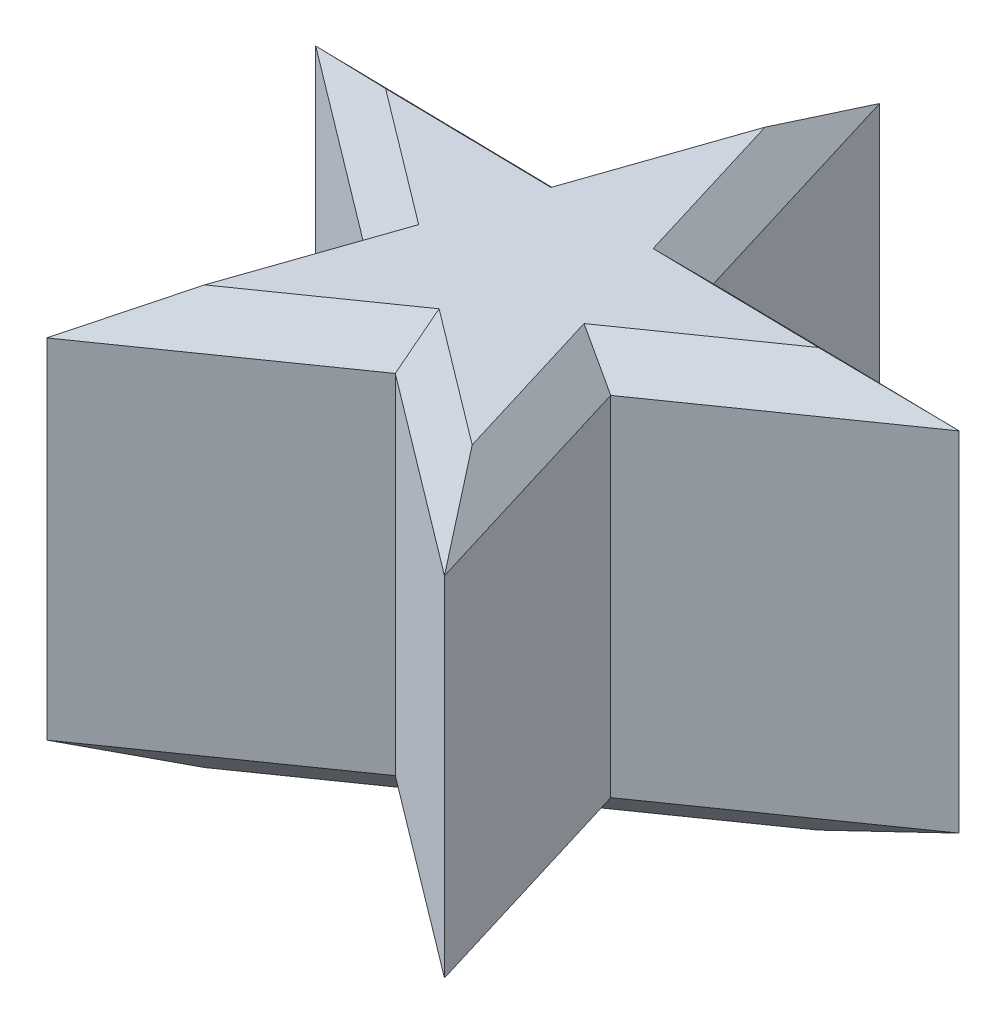
ISO-10303-21;
HEADER;
FILE_DESCRIPTION(('STEP AP214'),'2;1');
FILE_NAME('part.step','',(''),(''),'','','');
FILE_SCHEMA(('AUTOMOTIVE_DESIGN { 1 0 10303 214 1 1 1 1 }'));
ENDSEC;
DATA;
#1=APPLICATION_CONTEXT('core data for automotive mechanical design processes');
#2=APPLICATION_PROTOCOL_DEFINITION('international standard','automotive_design',2000,#1);
#3=PRODUCT_CONTEXT('',#1,'mechanical');
#4=PRODUCT('Part','Part','',(#3));
#5=PRODUCT_RELATED_PRODUCT_CATEGORY('part','',(#4));
#6=PRODUCT_DEFINITION_FORMATION('','',#4);
#7=PRODUCT_DEFINITION_CONTEXT('part definition',#1,'design');
#8=PRODUCT_DEFINITION('design','',#6,#7);
#9=PRODUCT_DEFINITION_SHAPE('','',#8);
#10=(LENGTH_UNIT() NAMED_UNIT(*) SI_UNIT(.MILLI.,.METRE.));
#11=(NAMED_UNIT(*) PLANE_ANGLE_UNIT() SI_UNIT($,.RADIAN.));
#12=(NAMED_UNIT(*) SI_UNIT($,.STERADIAN.) SOLID_ANGLE_UNIT());
#13=UNCERTAINTY_MEASURE_WITH_UNIT(LENGTH_MEASURE(1.E-05),#10,'distance_accuracy_value','');
#14=(GEOMETRIC_REPRESENTATION_CONTEXT(3) GLOBAL_UNCERTAINTY_ASSIGNED_CONTEXT((#13)) GLOBAL_UNIT_ASSIGNED_CONTEXT((#10,
#11,#12)) REPRESENTATION_CONTEXT('',''));
#15=CARTESIAN_POINT('',(0.,0.,0.));
#16=DIRECTION('',(0.,0.,1.));
#17=DIRECTION('',(1.,0.,0.));
#18=AXIS2_PLACEMENT_3D('',#15,#16,#17);
#19=CARTESIAN_POINT('',(-1.08284244959567,3.,-1.54727178912029));
#20=DIRECTION('',(0.945438206929282,0.,0.325801468502436));
#21=DIRECTION('',(0.325801468502436,0.,-0.945438206929282));
#22=AXIS2_PLACEMENT_3D('',#19,#20,#21);
#23=PLANE('',#22);
#24=DIRECTION('',(0.,-1.,0.));
#25=VECTOR('',#24,1.);
#26=CARTESIAN_POINT('',(0.087509343750781,3.,-4.94349742942818));
#27=LINE('',#26,#25);
#28=CARTESIAN_POINT('',(0.087509343750781,2.5,-4.94349742942818));
#29=VERTEX_POINT('',#28);
#30=CARTESIAN_POINT('',(0.087509343750781,-2.5,-4.94349742942818));
#31=VERTEX_POINT('',#30);
#32=EDGE_CURVE('E311',#29,#31,#27,.T.);
#33=ORIENTED_EDGE('',*,*,#32,.T.);
#34=DIRECTION('',(-0.325801468502436,0.,0.945438206929282));
#35=VECTOR('',#34,1.);
#36=CARTESIAN_POINT('',(-1.08284244959567,-2.5,-1.54727178912029));
#37=LINE('',#36,#35);
#38=CARTESIAN_POINT('',(-1.08284244959567,-2.5,-1.54727178912029));
#39=VERTEX_POINT('',#38);
#40=EDGE_CURVE('E266',#31,#39,#37,.T.);
#41=ORIENTED_EDGE('',*,*,#40,.T.);
#42=DIRECTION('',(0.,-1.,0.));
#43=VECTOR('',#42,1.);
#44=CARTESIAN_POINT('',(-1.08284244959567,3.,-1.54727178912029));
#45=LINE('',#44,#43);
#46=CARTESIAN_POINT('',(-1.08284244959567,2.5,-1.54727178912029));
#47=VERTEX_POINT('',#46);
#48=EDGE_CURVE('E193',#47,#39,#45,.T.);
#49=ORIENTED_EDGE('',*,*,#48,.F.);
#50=DIRECTION('',(0.325801468502436,0.,-0.945438206929282));
#51=VECTOR('',#50,1.);
#52=CARTESIAN_POINT('',(-1.08284244959567,2.5,-1.54727178912029));
#53=LINE('',#52,#51);
#54=EDGE_CURVE('E264',#47,#29,#53,.T.);
#55=ORIENTED_EDGE('',*,*,#54,.T.);
#56=EDGE_LOOP('',(#33,#41,#49,#55));
#57=FACE_BOUND('',#56,.T.);
#58=ADVANCED_FACE('F33',(#57),#23,.F.);
#59=CARTESIAN_POINT('',(-4.67450356916042,3.,-1.61085104895307));
#60=DIRECTION('',(-0.0176991365652454,0.,0.999843358014067));
#61=DIRECTION('',(0.999843358014067,0.,0.0176991365652454));
#62=AXIS2_PLACEMENT_3D('',#59,#60,#61);
#63=PLANE('',#62);
#64=ORIENTED_EDGE('',*,*,#48,.T.);
#65=DIRECTION('',(-0.999843358014067,0.,-0.0176991365652454));
#66=VECTOR('',#65,1.);
#67=CARTESIAN_POINT('',(-4.67450356916042,-2.5,-1.61085104895307));
#68=LINE('',#67,#66);
#69=CARTESIAN_POINT('',(-4.67450356916042,-2.5,-1.61085104895307));
#70=VERTEX_POINT('',#69);
#71=EDGE_CURVE('E192',#39,#70,#68,.T.);
#72=ORIENTED_EDGE('',*,*,#71,.T.);
#73=DIRECTION('',(0.,-1.,0.));
#74=VECTOR('',#73,1.);
#75=CARTESIAN_POINT('',(-4.67450356916042,3.,-1.61085104895307));
#76=LINE('',#75,#74);
#77=CARTESIAN_POINT('',(-4.67450356916042,2.5,-1.61085104895307));
#78=VERTEX_POINT('',#77);
#79=EDGE_CURVE('E174',#78,#70,#76,.T.);
#80=ORIENTED_EDGE('',*,*,#79,.F.);
#81=DIRECTION('',(0.999843358014067,0.,0.0176991365652454));
#82=VECTOR('',#81,1.);
#83=CARTESIAN_POINT('',(-4.67450356916042,2.5,-1.61085104895307));
#84=LINE('',#83,#82);
#85=EDGE_CURVE('E189',#78,#47,#84,.T.);
#86=ORIENTED_EDGE('',*,*,#85,.T.);
#87=EDGE_LOOP('',(#64,#72,#80,#86));
#88=FACE_BOUND('',#87,.T.);
#89=ADVANCED_FACE('F187',(#88),#63,.F.);
#90=CARTESIAN_POINT('',(-1.80615963667817,3.,0.551711090053868));
#91=DIRECTION('',(0.602012082710298,0.,-0.798486976894933));
#92=DIRECTION('',(-0.798486976894933,0.,-0.602012082710298));
#93=AXIS2_PLACEMENT_3D('',#90,#91,#92);
#94=PLANE('',#93);
#95=ORIENTED_EDGE('',*,*,#79,.T.);
#96=DIRECTION('',(0.798486976894933,0.,0.602012082710298));
#97=VECTOR('',#96,1.);
#98=CARTESIAN_POINT('',(-1.80615963667817,-2.5,0.551711090053868));
#99=LINE('',#98,#97);
#100=CARTESIAN_POINT('',(-1.80615963667817,-2.5,0.551711090053868));
#101=VERTEX_POINT('',#100);
#102=EDGE_CURVE('E181',#70,#101,#99,.T.);
#103=ORIENTED_EDGE('',*,*,#102,.T.);
#104=DIRECTION('',(0.,-1.,0.));
#105=VECTOR('',#104,1.);
#106=CARTESIAN_POINT('',(-1.80615963667817,3.,0.551711090053868));
#107=LINE('',#106,#105);
#108=CARTESIAN_POINT('',(-1.80615963667817,2.5,0.551711090053868));
#109=VERTEX_POINT('',#108);
#110=EDGE_CURVE('E176',#109,#101,#107,.T.);
#111=ORIENTED_EDGE('',*,*,#110,.F.);
#112=DIRECTION('',(-0.798486976894933,0.,-0.602012082710298));
#113=VECTOR('',#112,1.);
#114=CARTESIAN_POINT('',(-1.80615963667817,2.5,0.551711090053868));
#115=LINE('',#114,#113);
#116=EDGE_CURVE('E171',#109,#78,#115,.T.);
#117=ORIENTED_EDGE('',*,*,#116,.T.);
#118=EDGE_LOOP('',(#95,#103,#111,#117));
#119=FACE_BOUND('',#118,.T.);
#120=ADVANCED_FACE('F173',(#119),#94,.F.);
#121=CARTESIAN_POINT('',(-2.97651143002462,3.,3.94793673036177));
#122=DIRECTION('',(0.945438206929282,0.,0.325801468502436));
#123=DIRECTION('',(0.325801468502436,0.,-0.945438206929282));
#124=AXIS2_PLACEMENT_3D('',#121,#122,#123);
#125=PLANE('',#124);
#126=ORIENTED_EDGE('',*,*,#110,.T.);
#127=DIRECTION('',(-0.325801468502436,0.,0.945438206929282));
#128=VECTOR('',#127,1.);
#129=CARTESIAN_POINT('',(-2.97651143002462,-2.5,3.94793673036177));
#130=LINE('',#129,#128);
#131=CARTESIAN_POINT('',(-2.97651143002462,-2.5,3.94793673036177));
#132=VERTEX_POINT('',#131);
#133=EDGE_CURVE('E237',#101,#132,#130,.T.);
#134=ORIENTED_EDGE('',*,*,#133,.T.);
#135=DIRECTION('',(0.,-1.,0.));
#136=VECTOR('',#135,1.);
#137=CARTESIAN_POINT('',(-2.97651143002462,3.,3.94793673036177));
#138=LINE('',#137,#136);
#139=CARTESIAN_POINT('',(-2.97651143002462,2.5,3.94793673036177));
#140=VERTEX_POINT('',#139);
#141=EDGE_CURVE('E346',#140,#132,#138,.T.);
#142=ORIENTED_EDGE('',*,*,#141,.F.);
#143=DIRECTION('',(0.325801468502436,0.,-0.945438206929282));
#144=VECTOR('',#143,1.);
#145=CARTESIAN_POINT('',(-2.97651143002462,2.5,3.94793673036177));
#146=LINE('',#145,#144);
#147=EDGE_CURVE('E235',#140,#109,#146,.T.);
#148=ORIENTED_EDGE('',*,*,#147,.T.);
#149=EDGE_LOOP('',(#126,#134,#142,#148));
#150=FACE_BOUND('',#149,.T.);
#151=ADVANCED_FACE('F351',(#150),#125,.F.);
#152=CARTESIAN_POINT('',(-0.0334255949796022,3.,1.88824799474383));
#153=DIRECTION('',(-0.573374278176205,0.,-0.819293559797656));
#154=DIRECTION('',(-0.819293559797656,0.,0.573374278176205));
#155=AXIS2_PLACEMENT_3D('',#152,#153,#154);
#156=PLANE('',#155);
#157=ORIENTED_EDGE('',*,*,#141,.T.);
#158=DIRECTION('',(0.819293559797656,0.,-0.573374278176205));
#159=VECTOR('',#158,1.);
#160=CARTESIAN_POINT('',(-0.0334255949796022,-2.5,1.88824799474383));
#161=LINE('',#160,#159);
#162=CARTESIAN_POINT('',(-0.0334255949796022,-2.5,1.88824799474383));
#163=VERTEX_POINT('',#162);
#164=EDGE_CURVE('E241',#132,#163,#161,.T.);
#165=ORIENTED_EDGE('',*,*,#164,.T.);
#166=DIRECTION('',(0.,-1.,0.));
#167=VECTOR('',#166,1.);
#168=CARTESIAN_POINT('',(-0.0334255949796022,3.,1.88824799474383));
#169=LINE('',#168,#167);
#170=CARTESIAN_POINT('',(-0.0334255949796022,2.5,1.88824799474383));
#171=VERTEX_POINT('',#170);
#172=EDGE_CURVE('E349',#171,#163,#169,.T.);
#173=ORIENTED_EDGE('',*,*,#172,.F.);
#174=DIRECTION('',(-0.819293559797656,0.,0.573374278176205));
#175=VECTOR('',#174,1.);
#176=CARTESIAN_POINT('',(-0.0334255949796022,2.5,1.88824799474383));
#177=LINE('',#176,#175);
#178=EDGE_CURVE('E239',#171,#140,#177,.T.);
#179=ORIENTED_EDGE('',*,*,#178,.T.);
#180=EDGE_LOOP('',(#157,#165,#173,#179));
#181=FACE_BOUND('',#180,.T.);
#182=ADVANCED_FACE('F345',(#181),#156,.F.);
#183=CARTESIAN_POINT('',(2.83491833750265,3.,4.05081013375077));
#184=DIRECTION('',(0.602012082710298,0.,-0.798486976894933));
#185=DIRECTION('',(-0.798486976894933,0.,-0.602012082710298));
#186=AXIS2_PLACEMENT_3D('',#183,#184,#185);
#187=PLANE('',#186);
#188=ORIENTED_EDGE('',*,*,#172,.T.);
#189=DIRECTION('',(0.798486976894933,0.,0.602012082710298));
#190=VECTOR('',#189,1.);
#191=CARTESIAN_POINT('',(2.83491833750266,-2.5,4.05081013375077));
#192=LINE('',#191,#190);
#193=CARTESIAN_POINT('',(2.83491833750265,-2.5,4.05081013375077));
#194=VERTEX_POINT('',#193);
#195=EDGE_CURVE('E245',#163,#194,#192,.T.);
#196=ORIENTED_EDGE('',*,*,#195,.T.);
#197=DIRECTION('',(0.,-1.,0.));
#198=VECTOR('',#197,1.);
#199=CARTESIAN_POINT('',(2.83491833750265,3.,4.05081013375077));
#200=LINE('',#199,#198);
#201=CARTESIAN_POINT('',(2.83491833750265,2.5,4.05081013375077));
#202=VERTEX_POINT('',#201);
#203=EDGE_CURVE('E355',#202,#194,#200,.T.);
#204=ORIENTED_EDGE('',*,*,#203,.F.);
#205=DIRECTION('',(-0.798486976894933,0.,-0.602012082710298));
#206=VECTOR('',#205,1.);
#207=CARTESIAN_POINT('',(2.83491833750265,2.5,4.05081013375077));
#208=LINE('',#207,#206);
#209=EDGE_CURVE('E243',#202,#171,#208,.T.);
#210=ORIENTED_EDGE('',*,*,#209,.T.);
#211=EDGE_LOOP('',(#188,#196,#204,#210));
#212=FACE_BOUND('',#211,.T.);
#213=ADVANCED_FACE('F403',(#212),#187,.F.);
#214=CARTESIAN_POINT('',(1.78550148288659,3.,0.615290349886651));
#215=DIRECTION('',(-0.95637687489813,0.,0.292135710176087));
#216=DIRECTION('',(0.292135710176087,0.,0.95637687489813));
#217=AXIS2_PLACEMENT_3D('',#214,#215,#216);
#218=PLANE('',#217);
#219=ORIENTED_EDGE('',*,*,#203,.T.);
#220=DIRECTION('',(-0.292135710176087,0.,-0.95637687489813));
#221=VECTOR('',#220,1.);
#222=CARTESIAN_POINT('',(1.78550148288659,-2.5,0.615290349886651));
#223=LINE('',#222,#221);
#224=CARTESIAN_POINT('',(1.78550148288659,-2.5,0.615290349886651));
#225=VERTEX_POINT('',#224);
#226=EDGE_CURVE('E249',#194,#225,#223,.T.);
#227=ORIENTED_EDGE('',*,*,#226,.T.);
#228=DIRECTION('',(0.,-1.,0.));
#229=VECTOR('',#228,1.);
#230=CARTESIAN_POINT('',(1.78550148288659,3.,0.615290349886651));
#231=LINE('',#230,#229);
#232=CARTESIAN_POINT('',(1.78550148288659,2.5,0.615290349886651));
#233=VERTEX_POINT('',#232);
#234=EDGE_CURVE('E360',#233,#225,#231,.T.);
#235=ORIENTED_EDGE('',*,*,#234,.F.);
#236=DIRECTION('',(0.292135710176087,0.,0.95637687489813));
#237=VECTOR('',#236,1.);
#238=CARTESIAN_POINT('',(1.78550148288659,2.5,0.615290349886651));
#239=LINE('',#238,#237);
#240=EDGE_CURVE('E247',#233,#202,#239,.T.);
#241=ORIENTED_EDGE('',*,*,#240,.T.);
#242=EDGE_LOOP('',(#219,#227,#235,#241));
#243=FACE_BOUND('',#242,.T.);
#244=ADVANCED_FACE('F417',(#243),#218,.F.);
#245=CARTESIAN_POINT('',(4.7285873179316,3.,-1.44439838573128));
#246=DIRECTION('',(-0.573374278176205,0.,-0.819293559797656));
#247=DIRECTION('',(-0.819293559797656,0.,0.573374278176205));
#248=AXIS2_PLACEMENT_3D('',#245,#246,#247);
#249=PLANE('',#248);
#250=ORIENTED_EDGE('',*,*,#234,.T.);
#251=DIRECTION('',(0.819293559797656,0.,-0.573374278176205));
#252=VECTOR('',#251,1.);
#253=CARTESIAN_POINT('',(4.7285873179316,-2.5,-1.44439838573128));
#254=LINE('',#253,#252);
#255=CARTESIAN_POINT('',(4.7285873179316,-2.5,-1.44439838573128));
#256=VERTEX_POINT('',#255);
#257=EDGE_CURVE('E253',#225,#256,#254,.T.);
#258=ORIENTED_EDGE('',*,*,#257,.T.);
#259=DIRECTION('',(0.,-1.,0.));
#260=VECTOR('',#259,1.);
#261=CARTESIAN_POINT('',(4.7285873179316,3.,-1.44439838573128));
#262=LINE('',#261,#260);
#263=CARTESIAN_POINT('',(4.7285873179316,2.5,-1.44439838573128));
#264=VERTEX_POINT('',#263);
#265=EDGE_CURVE('E363',#264,#256,#262,.T.);
#266=ORIENTED_EDGE('',*,*,#265,.F.);
#267=DIRECTION('',(-0.819293559797656,0.,0.573374278176205));
#268=VECTOR('',#267,1.);
#269=CARTESIAN_POINT('',(4.7285873179316,2.5,-1.44439838573128));
#270=LINE('',#269,#268);
#271=EDGE_CURVE('E251',#264,#233,#270,.T.);
#272=ORIENTED_EDGE('',*,*,#271,.T.);
#273=EDGE_LOOP('',(#250,#258,#266,#272));
#274=FACE_BOUND('',#273,.T.);
#275=ADVANCED_FACE('F420',(#274),#249,.F.);
#276=CARTESIAN_POINT('',(1.13692619836685,3.,-1.50797764556407));
#277=DIRECTION('',(-0.0176991365652454,0.,0.999843358014067));
#278=DIRECTION('',(0.999843358014067,0.,0.0176991365652454));
#279=AXIS2_PLACEMENT_3D('',#276,#277,#278);
#280=PLANE('',#279);
#281=ORIENTED_EDGE('',*,*,#265,.T.);
#282=DIRECTION('',(-0.999843358014067,0.,-0.0176991365652454));
#283=VECTOR('',#282,1.);
#284=CARTESIAN_POINT('',(1.13692619836685,-2.5,-1.50797764556407));
#285=LINE('',#284,#283);
#286=CARTESIAN_POINT('',(1.13692619836685,-2.5,-1.50797764556407));
#287=VERTEX_POINT('',#286);
#288=EDGE_CURVE('E257',#256,#287,#285,.T.);
#289=ORIENTED_EDGE('',*,*,#288,.T.);
#290=DIRECTION('',(0.,-1.,0.));
#291=VECTOR('',#290,1.);
#292=CARTESIAN_POINT('',(1.13692619836685,3.,-1.50797764556407));
#293=LINE('',#292,#291);
#294=CARTESIAN_POINT('',(1.13692619836685,2.5,-1.50797764556407));
#295=VERTEX_POINT('',#294);
#296=EDGE_CURVE('E366',#295,#287,#293,.T.);
#297=ORIENTED_EDGE('',*,*,#296,.F.);
#298=DIRECTION('',(0.999843358014067,0.,0.0176991365652454));
#299=VECTOR('',#298,1.);
#300=CARTESIAN_POINT('',(1.13692619836685,2.5,-1.50797764556407));
#301=LINE('',#300,#299);
#302=EDGE_CURVE('E255',#295,#264,#301,.T.);
#303=ORIENTED_EDGE('',*,*,#302,.T.);
#304=EDGE_LOOP('',(#281,#289,#297,#303));
#305=FACE_BOUND('',#304,.T.);
#306=ADVANCED_FACE('F490',(#305),#280,.F.);
#307=CARTESIAN_POINT('',(0.087509343750781,3.,-4.94349742942818));
#308=DIRECTION('',(-0.95637687489813,0.,0.292135710176087));
#309=DIRECTION('',(0.292135710176087,0.,0.95637687489813));
#310=AXIS2_PLACEMENT_3D('',#307,#308,#309);
#311=PLANE('',#310);
#312=ORIENTED_EDGE('',*,*,#296,.T.);
#313=DIRECTION('',(-0.292135710176087,0.,-0.95637687489813));
#314=VECTOR('',#313,1.);
#315=CARTESIAN_POINT('',(0.0875093437507808,-2.5,-4.94349742942818));
#316=LINE('',#315,#314);
#317=EDGE_CURVE('E262',#287,#31,#316,.T.);
#318=ORIENTED_EDGE('',*,*,#317,.T.);
#319=ORIENTED_EDGE('',*,*,#32,.F.);
#320=DIRECTION('',(0.292135710176087,0.,0.95637687489813));
#321=VECTOR('',#320,1.);
#322=CARTESIAN_POINT('',(0.087509343750781,2.5,-4.94349742942818));
#323=LINE('',#322,#321);
#324=EDGE_CURVE('E259',#29,#295,#323,.T.);
#325=ORIENTED_EDGE('',*,*,#324,.T.);
#326=EDGE_LOOP('',(#312,#318,#319,#325));
#327=FACE_BOUND('',#326,.T.);
#328=ADVANCED_FACE('F485',(#327),#311,.F.);
#329=CARTESIAN_POINT('',(0.,3.,0.));
#330=DIRECTION('',(0.,-1.,0.));
#331=DIRECTION('',(0.,0.,-1.));
#332=AXIS2_PLACEMENT_3D('',#329,#330,#331);
#333=PLANE('',#332);
#334=DIRECTION('',(-0.999843358014067,0.,-0.0176991365652454));
#335=VECTOR('',#334,1.);
#336=CARTESIAN_POINT('',(0.018192306102968,3.,-1.02770303833514));
#337=LINE('',#336,#335);
#338=CARTESIAN_POINT('',(3.18113702829202,3.,-0.971712877338785));
#339=VERTEX_POINT('',#338);
#340=CARTESIAN_POINT('',(0.764862269613771,3.,-1.01448555426884));
#341=VERTEX_POINT('',#340);
#342=EDGE_CURVE('E42',#339,#341,#337,.T.);
#343=ORIENTED_EDGE('',*,*,#342,.T.);
#344=DIRECTION('',(-0.292135710176087,0.,-0.95637687489813));
#345=VECTOR('',#344,1.);
#346=CARTESIAN_POINT('',(0.983025403177652,3.,-0.300275792750663));
#347=LINE('',#346,#345);
#348=CARTESIAN_POINT('',(0.0588715392166878,3.,-3.32571689273559));
#349=VERTEX_POINT('',#348);
#350=EDGE_CURVE('E11',#341,#349,#347,.T.);
#351=ORIENTED_EDGE('',*,*,#350,.T.);
#352=DIRECTION('',(-0.325801468502436,0.,0.945438206929282));
#353=VECTOR('',#352,1.);
#354=CARTESIAN_POINT('',(-0.971781939672278,3.,-0.334879615281991));
#355=LINE('',#354,#353);
#356=CARTESIAN_POINT('',(-0.728477657407837,3.,-1.04092052240144));
#357=VERTEX_POINT('',#356);
#358=EDGE_CURVE('E268',#349,#357,#355,.T.);
#359=ORIENTED_EDGE('',*,*,#358,.T.);
#360=DIRECTION('',(-0.999843358014067,0.,-0.0176991365652454));
#361=VECTOR('',#360,1.);
#362=CARTESIAN_POINT('',(0.018192306102968,3.,-1.02770303833514));
#363=LINE('',#362,#361);
#364=CARTESIAN_POINT('',(-3.14475241608609,3.,-1.0836931993315));
#365=VERTEX_POINT('',#364);
#366=EDGE_CURVE('E270',#357,#365,#363,.T.);
#367=ORIENTED_EDGE('',*,*,#366,.T.);
#368=DIRECTION('',(0.798486976894933,0.,0.602012082710298));
#369=VECTOR('',#368,1.);
#370=CARTESIAN_POINT('',(-0.618786574473734,3.,0.820736053951382));
#371=LINE('',#370,#369);
#372=CARTESIAN_POINT('',(-1.21508622193672,3.,0.371161291837457));
#373=VERTEX_POINT('',#372);
#374=EDGE_CURVE('E199',#365,#373,#371,.T.);
#375=ORIENTED_EDGE('',*,*,#374,.T.);
#376=DIRECTION('',(-0.325801468502436,0.,0.945438206929282));
#377=VECTOR('',#376,1.);
#378=CARTESIAN_POINT('',(-0.971781939672277,3.,-0.334879615281991));
#379=LINE('',#378,#377);
#380=CARTESIAN_POINT('',(-2.00243541856124,3.,2.65595766217161));
#381=VERTEX_POINT('',#380);
#382=EDGE_CURVE('E273',#373,#381,#379,.T.);
#383=ORIENTED_EDGE('',*,*,#382,.T.);
#384=DIRECTION('',(0.819293559797656,0.,-0.573374278176205));
#385=VECTOR('',#384,1.);
#386=CARTESIAN_POINT('',(0.589350804865389,3.,0.842122392416411));
#387=LINE('',#386,#385);
#388=CARTESIAN_POINT('',(-0.0224869270107549,3.,1.27031081606531));
#389=VERTEX_POINT('',#388);
#390=EDGE_CURVE('E275',#381,#389,#387,.T.);
#391=ORIENTED_EDGE('',*,*,#390,.T.);
#392=DIRECTION('',(0.798486976894933,0.,0.602012082710298));
#393=VECTOR('',#392,1.);
#394=CARTESIAN_POINT('',(-0.618786574473735,3.,0.820736053951384));
#395=LINE('',#394,#393);
#396=CARTESIAN_POINT('',(1.90717926713862,3.,2.72516530723426));
#397=VERTEX_POINT('',#396);
#398=EDGE_CURVE('E277',#389,#397,#395,.T.);
#399=ORIENTED_EDGE('',*,*,#398,.T.);
#400=DIRECTION('',(-0.292135710176087,0.,-0.95637687489813));
#401=VECTOR('',#400,1.);
#402=CARTESIAN_POINT('',(0.983025403177651,3.,-0.300275792750663));
#403=LINE('',#402,#401);
#404=CARTESIAN_POINT('',(1.20118853674153,3.,0.413933968767517));
#405=VERTEX_POINT('',#404);
#406=EDGE_CURVE('E279',#397,#405,#403,.T.);
#407=ORIENTED_EDGE('',*,*,#406,.T.);
#408=DIRECTION('',(0.819293559797656,0.,-0.573374278176205));
#409=VECTOR('',#408,1.);
#410=CARTESIAN_POINT('',(0.589350804865389,3.,0.842122392416412));
#411=LINE('',#410,#409);
#412=EDGE_CURVE('E53',#405,#339,#411,.T.);
#413=ORIENTED_EDGE('',*,*,#412,.T.);
#414=EDGE_LOOP('',(#343,#351,#359,#367,#375,#383,#391,#399,#407,#413));
#415=FACE_BOUND('',#414,.T.);
#416=ADVANCED_FACE('F434',(#415),#333,.F.);
#417=CARTESIAN_POINT('',(0.,-3.,0.));
#418=DIRECTION('',(0.,-1.,0.));
#419=DIRECTION('',(0.,0.,-1.));
#420=AXIS2_PLACEMENT_3D('',#417,#418,#419);
#421=PLANE('',#420);
#422=DIRECTION('',(-0.798486976894933,0.,-0.602012082710298));
#423=VECTOR('',#422,1.);
#424=CARTESIAN_POINT('',(-4.37349752780527,-3.,-2.01009453740054));
#425=LINE('',#424,#423);
#426=CARTESIAN_POINT('',(-1.21508622193672,-3.,0.371161291837456));
#427=VERTEX_POINT('',#426);
#428=CARTESIAN_POINT('',(-3.14475241608608,-3.,-1.0836931993315));
#429=VERTEX_POINT('',#428);
#430=EDGE_CURVE('E230',#427,#429,#425,.T.);
#431=ORIENTED_EDGE('',*,*,#430,.T.);
#432=DIRECTION('',(0.999843358014067,0.,0.0176991365652454));
#433=VECTOR('',#432,1.);
#434=CARTESIAN_POINT('',(-1.09169201787829,-3.,-1.04735011011325));
#435=LINE('',#434,#433);
#436=CARTESIAN_POINT('',(-0.728477657407836,-3.,-1.04092052240144));
#437=VERTEX_POINT('',#436);
#438=EDGE_CURVE('E182',#429,#437,#435,.T.);
#439=ORIENTED_EDGE('',*,*,#438,.T.);
#440=DIRECTION('',(0.325801468502436,0.,-0.945438206929282));
#441=VECTOR('',#440,1.);
#442=CARTESIAN_POINT('',(0.560228447215424,-3.,-4.78059669517696));
#443=LINE('',#442,#441);
#444=CARTESIAN_POINT('',(0.0588715392166878,-3.,-3.32571689273559));
#445=VERTEX_POINT('',#444);
#446=EDGE_CURVE('E211',#437,#445,#443,.T.);
#447=ORIENTED_EDGE('',*,*,#446,.T.);
#448=DIRECTION('',(0.292135710176087,0.,0.95637687489813));
#449=VECTOR('',#448,1.);
#450=CARTESIAN_POINT('',(0.658737760917781,-3.,-1.36190979047602));
#451=LINE('',#450,#449);
#452=CARTESIAN_POINT('',(0.76486226961377,-3.,-1.01448555426884));
#453=VERTEX_POINT('',#452);
#454=EDGE_CURVE('E216',#445,#453,#451,.T.);
#455=ORIENTED_EDGE('',*,*,#454,.T.);
#456=DIRECTION('',(0.999843358014067,0.,0.0176991365652454));
#457=VECTOR('',#456,1.);
#458=CARTESIAN_POINT('',(4.71973774964898,-3.,-0.944476706724247));
#459=LINE('',#458,#457);
#460=CARTESIAN_POINT('',(3.18113702829202,-3.,-0.971712877338784));
#461=VERTEX_POINT('',#460);
#462=EDGE_CURVE('E218',#453,#461,#459,.T.);
#463=ORIENTED_EDGE('',*,*,#462,.T.);
#464=DIRECTION('',(-0.819293559797656,0.,0.573374278176205));
#465=VECTOR('',#464,1.);
#466=CARTESIAN_POINT('',(1.49881434379848,-3.,0.205643569987821));
#467=LINE('',#466,#465);
#468=CARTESIAN_POINT('',(1.20118853674153,-3.,0.413933968767517));
#469=VERTEX_POINT('',#468);
#470=EDGE_CURVE('E220',#461,#469,#467,.T.);
#471=ORIENTED_EDGE('',*,*,#470,.T.);
#472=DIRECTION('',(0.292135710176087,0.,0.95637687489813));
#473=VECTOR('',#472,1.);
#474=CARTESIAN_POINT('',(2.35672990005359,-3.,4.19687798883881));
#475=LINE('',#474,#473);
#476=CARTESIAN_POINT('',(1.90717926713861,-3.,2.72516530723426));
#477=VERTEX_POINT('',#476);
#478=EDGE_CURVE('E222',#469,#477,#475,.T.);
#479=ORIENTED_EDGE('',*,*,#478,.T.);
#480=DIRECTION('',(-0.798486976894933,0.,-0.602012082710298));
#481=VECTOR('',#480,1.);
#482=CARTESIAN_POINT('',(0.267580446375548,-3.,1.48900450629636));
#483=LINE('',#482,#481);
#484=CARTESIAN_POINT('',(-0.022486927010754,-3.,1.2703108160653));
#485=VERTEX_POINT('',#484);
#486=EDGE_CURVE('E224',#477,#485,#483,.T.);
#487=ORIENTED_EDGE('',*,*,#486,.T.);
#488=DIRECTION('',(-0.819293559797656,0.,0.573374278176205));
#489=VECTOR('',#488,1.);
#490=CARTESIAN_POINT('',(-3.26319856911272,-3.,3.53828995046293));
#491=LINE('',#490,#489);
#492=CARTESIAN_POINT('',(-2.00243541856124,-3.,2.65595766217161));
#493=VERTEX_POINT('',#492);
#494=EDGE_CURVE('E226',#485,#493,#491,.T.);
#495=ORIENTED_EDGE('',*,*,#494,.T.);
#496=DIRECTION('',(0.325801468502436,0.,-0.945438206929282));
#497=VECTOR('',#496,1.);
#498=CARTESIAN_POINT('',(-1.33344053321353,-3.,0.714611824305086));
#499=LINE('',#498,#497);
#500=EDGE_CURVE('E228',#493,#427,#499,.T.);
#501=ORIENTED_EDGE('',*,*,#500,.T.);
#502=EDGE_LOOP('',(#431,#439,#447,#455,#463,#471,#479,#487,#495,#501));
#503=FACE_BOUND('',#502,.T.);
#504=ADVANCED_FACE('F476',(#503),#421,.T.);
#505=CARTESIAN_POINT('',(1.78550148288659,-2.5,0.615290349886651));
#506=DIRECTION('',(0.676260573610466,-0.707106781186548,-0.206571141692259));
#507=DIRECTION('',(0.292135710176087,0.,0.95637687489813));
#508=AXIS2_PLACEMENT_3D('',#505,#506,#507);
#509=PLANE('',#508);
#510=DIRECTION('',(-0.547814722539664,-0.295241808844326,-0.78277155293171));
#511=VECTOR('',#510,1.);
#512=CARTESIAN_POINT('',(1.04678909275726,-3.46370267344877,1.4957552070358));
#513=LINE('',#512,#511);
#514=EDGE_CURVE('E305',#477,#194,#513,.F.);
#515=ORIENTED_EDGE('',*,*,#514,.F.);
#516=ORIENTED_EDGE('',*,*,#478,.F.);
#517=DIRECTION('',(-0.735019139466434,-0.628960169645094,-0.253290287255625));
#518=VECTOR('',#517,1.);
#519=CARTESIAN_POINT('',(1.78550148288659,-2.5,0.615290349886651));
#520=LINE('',#519,#518);
#521=EDGE_CURVE('E308',#225,#469,#520,.T.);
#522=ORIENTED_EDGE('',*,*,#521,.F.);
#523=ORIENTED_EDGE('',*,*,#226,.F.);
#524=EDGE_LOOP('',(#515,#516,#522,#523));
#525=FACE_BOUND('',#524,.T.);
#526=ADVANCED_FACE('F412',(#525),#509,.T.);
#527=CARTESIAN_POINT('',(4.7285873179316,-2.5,-1.44439838573128));
#528=DIRECTION('',(0.405436840256336,-0.707106781186548,0.579328031915389));
#529=DIRECTION('',(-0.819293559797656,0.,0.573374278176205));
#530=AXIS2_PLACEMENT_3D('',#527,#528,#529);
#531=PLANE('',#530);
#532=ORIENTED_EDGE('',*,*,#521,.T.);
#533=ORIENTED_EDGE('',*,*,#470,.F.);
#534=DIRECTION('',(-0.913744045219733,-0.295241808844326,0.279113049024602));
#535=VECTOR('',#534,1.);
#536=CARTESIAN_POINT('',(1.74602335562213,-3.46370267344877,-0.533341809454602));
#537=LINE('',#536,#535);
#538=EDGE_CURVE('E302',#256,#461,#537,.T.);
#539=ORIENTED_EDGE('',*,*,#538,.F.);
#540=ORIENTED_EDGE('',*,*,#257,.F.);
#541=EDGE_LOOP('',(#532,#533,#539,#540));
#542=FACE_BOUND('',#541,.T.);
#543=ADVANCED_FACE('F471',(#542),#531,.T.);
#544=CARTESIAN_POINT('',(2.83491833750265,-2.5,4.05081013375077));
#545=DIRECTION('',(-0.425686826040688,-0.707106781186548,0.564615556051553));
#546=DIRECTION('',(-0.798486976894933,0.,-0.602012082710298));
#547=AXIS2_PLACEMENT_3D('',#544,#545,#546);
#548=PLANE('',#547);
#549=ORIENTED_EDGE('',*,*,#514,.T.);
#550=ORIENTED_EDGE('',*,*,#195,.F.);
#551=DIRECTION('',(0.0137599729227558,-0.628960169645094,-0.777315745463309));
#552=VECTOR('',#551,1.);
#553=CARTESIAN_POINT('',(-0.0334255949796022,-2.5,1.88824799474383));
#554=LINE('',#553,#552);
#555=EDGE_CURVE('E299',#485,#163,#554,.F.);
#556=ORIENTED_EDGE('',*,*,#555,.F.);
#557=ORIENTED_EDGE('',*,*,#486,.F.);
#558=EDGE_LOOP('',(#549,#550,#556,#557));
#559=FACE_BOUND('',#558,.T.);
#560=ADVANCED_FACE('F406',(#559),#548,.T.);
#561=CARTESIAN_POINT('',(1.13692619836685,-2.5,-1.50797764556407));
#562=DIRECTION('',(0.0125151794864318,-0.707106781186547,-0.706996018576075));
#563=DIRECTION('',(0.999843358014067,0.,0.0176991365652454));
#564=AXIS2_PLACEMENT_3D('',#561,#562,#563);
#565=PLANE('',#564);
#566=ORIENTED_EDGE('',*,*,#538,.T.);
#567=ORIENTED_EDGE('',*,*,#462,.F.);
#568=DIRECTION('',(-0.468026783494711,-0.628960169645094,0.620773738919108));
#569=VECTOR('',#568,1.);
#570=CARTESIAN_POINT('',(1.13692619836685,-2.5,-1.50797764556407));
#571=LINE('',#570,#569);
#572=EDGE_CURVE('E296',#287,#453,#571,.T.);
#573=ORIENTED_EDGE('',*,*,#572,.F.);
#574=ORIENTED_EDGE('',*,*,#288,.F.);
#575=EDGE_LOOP('',(#566,#567,#573,#574));
#576=FACE_BOUND('',#575,.T.);
#577=ADVANCED_FACE('F465',(#576),#565,.T.);
#578=CARTESIAN_POINT('',(-0.0334255949796022,-2.5,1.88824799474383));
#579=DIRECTION('',(0.405436840256337,-0.707106781186547,0.579328031915389));
#580=DIRECTION('',(-0.819293559797656,0.,0.573374278176205));
#581=AXIS2_PLACEMENT_3D('',#578,#579,#580);
#582=PLANE('',#581);
#583=ORIENTED_EDGE('',*,*,#555,.T.);
#584=ORIENTED_EDGE('',*,*,#164,.F.);
#585=DIRECTION('',(0.575175927152627,-0.295241808844326,-0.762892474162936));
#586=VECTOR('',#585,1.);
#587=CARTESIAN_POINT('',(-1.09907211724548,-3.46370267344877,1.45776936625236));
#588=LINE('',#587,#586);
#589=EDGE_CURVE('E293',#493,#132,#588,.F.);
#590=ORIENTED_EDGE('',*,*,#589,.F.);
#591=ORIENTED_EDGE('',*,*,#494,.F.);
#592=EDGE_LOOP('',(#583,#584,#590,#591));
#593=FACE_BOUND('',#592,.T.);
#594=ADVANCED_FACE('F399',(#593),#582,.T.);
#595=CARTESIAN_POINT('',(0.087509343750781,-2.5,-4.94349742942818));
#596=DIRECTION('',(0.676260573610466,-0.707106781186547,-0.206571141692259));
#597=DIRECTION('',(0.292135710176087,0.,0.95637687489813));
#598=AXIS2_PLACEMENT_3D('',#595,#596,#597);
#599=PLANE('',#598);
#600=ORIENTED_EDGE('',*,*,#572,.T.);
#601=ORIENTED_EDGE('',*,*,#454,.F.);
#602=DIRECTION('',(-0.0169101544239518,-0.295241808844326,0.95527290393253));
#603=VECTOR('',#602,1.);
#604=CARTESIAN_POINT('',(0.0323126861683633,-3.46370267344877,-1.82537857290012));
#605=LINE('',#604,#603);
#606=EDGE_CURVE('E290',#31,#445,#605,.T.);
#607=ORIENTED_EDGE('',*,*,#606,.F.);
#608=ORIENTED_EDGE('',*,*,#317,.F.);
#609=EDGE_LOOP('',(#600,#601,#607,#608));
#610=FACE_BOUND('',#609,.T.);
#611=ADVANCED_FACE('F379',(#610),#599,.T.);
#612=CARTESIAN_POINT('',(-2.97651143002462,-2.5,3.94793673036177));
#613=DIRECTION('',(-0.668525767312546,-0.707106781186547,-0.230376427698608));
#614=DIRECTION('',(0.325801468502436,0.,-0.945438206929282));
#615=AXIS2_PLACEMENT_3D('',#612,#613,#614);
#616=PLANE('',#615);
#617=ORIENTED_EDGE('',*,*,#589,.T.);
#618=ORIENTED_EDGE('',*,*,#133,.F.);
#619=DIRECTION('',(0.743523270416975,-0.628960169645094,-0.227117263431162));
#620=VECTOR('',#619,1.);
#621=CARTESIAN_POINT('',(-1.80615963667817,-2.5,0.551711090053868));
#622=LINE('',#621,#620);
#623=EDGE_CURVE('E287',#427,#101,#622,.F.);
#624=ORIENTED_EDGE('',*,*,#623,.F.);
#625=ORIENTED_EDGE('',*,*,#500,.F.);
#626=EDGE_LOOP('',(#617,#618,#624,#625));
#627=FACE_BOUND('',#626,.T.);
#628=ADVANCED_FACE('F394',(#627),#616,.T.);
#629=CARTESIAN_POINT('',(-1.08284244959567,-2.5,-1.54727178912029));
#630=DIRECTION('',(-0.668525767312546,-0.707106781186548,-0.230376427698608));
#631=DIRECTION('',(0.325801468502436,0.,-0.945438206929282));
#632=AXIS2_PLACEMENT_3D('',#629,#630,#631);
#633=PLANE('',#632);
#634=ORIENTED_EDGE('',*,*,#606,.T.);
#635=ORIENTED_EDGE('',*,*,#446,.F.);
#636=DIRECTION('',(-0.445762679621415,0.628960169645094,-0.636949557230987));
#637=VECTOR('',#636,1.);
#638=CARTESIAN_POINT('',(-1.81457315098957,-1.46754599000055,-2.59284058070463));
#639=LINE('',#638,#637);
#640=EDGE_CURVE('E285',#39,#437,#639,.F.);
#641=ORIENTED_EDGE('',*,*,#640,.F.);
#642=ORIENTED_EDGE('',*,*,#40,.F.);
#643=EDGE_LOOP('',(#634,#635,#641,#642));
#644=FACE_BOUND('',#643,.T.);
#645=ADVANCED_FACE('F383',(#644),#633,.T.);
#646=CARTESIAN_POINT('',(-1.80615963667817,-2.5,0.551711090053868));
#647=DIRECTION('',(-0.425686826040689,-0.707106781186547,0.564615556051553));
#648=DIRECTION('',(-0.798486976894933,0.,-0.602012082710298));
#649=AXIS2_PLACEMENT_3D('',#646,#647,#648);
#650=PLANE('',#649);
#651=ORIENTED_EDGE('',*,*,#623,.T.);
#652=ORIENTED_EDGE('',*,*,#102,.F.);
#653=DIRECTION('',(0.903292995030721,-0.295241808844326,0.311278074137515));
#654=VECTOR('',#653,1.);
#655=CARTESIAN_POINT('',(-1.72605301730228,-3.46370267344877,-0.594804190933449));
#656=LINE('',#655,#654);
#657=EDGE_CURVE('E283',#429,#70,#656,.F.);
#658=ORIENTED_EDGE('',*,*,#657,.F.);
#659=ORIENTED_EDGE('',*,*,#430,.F.);
#660=EDGE_LOOP('',(#651,#652,#658,#659));
#661=FACE_BOUND('',#660,.T.);
#662=ADVANCED_FACE('F391',(#661),#650,.T.);
#663=CARTESIAN_POINT('',(-4.67450356916042,-2.5,-1.61085104895307));
#664=DIRECTION('',(0.0125151794864318,-0.707106781186547,-0.706996018576076));
#665=DIRECTION('',(0.999843358014067,0.,0.0176991365652454));
#666=AXIS2_PLACEMENT_3D('',#663,#664,#665);
#667=PLANE('',#666);
#668=ORIENTED_EDGE('',*,*,#640,.T.);
#669=ORIENTED_EDGE('',*,*,#438,.F.);
#670=ORIENTED_EDGE('',*,*,#657,.T.);
#671=ORIENTED_EDGE('',*,*,#71,.F.);
#672=EDGE_LOOP('',(#668,#669,#670,#671));
#673=FACE_BOUND('',#672,.T.);
#674=ADVANCED_FACE('F386',(#673),#667,.T.);
#675=CARTESIAN_POINT('',(0.589350804865389,3.,0.842122392416411));
#676=DIRECTION('',(-0.405436840256337,-0.707106781186546,-0.57932803191539));
#677=DIRECTION('',(0.819293559797656,0.,-0.573374278176205));
#678=AXIS2_PLACEMENT_3D('',#675,#676,#677);
#679=PLANE('',#678);
#680=DIRECTION('',(0.575175927152627,0.295241808844327,-0.762892474162936));
#681=VECTOR('',#680,1.);
#682=CARTESIAN_POINT('',(-0.349095482552853,3.84867090275868,0.463027577879103));
#683=LINE('',#682,#681);
#684=EDGE_CURVE('E325',#140,#381,#683,.T.);
#685=ORIENTED_EDGE('',*,*,#684,.F.);
#686=ORIENTED_EDGE('',*,*,#178,.F.);
#687=DIRECTION('',(0.0137599729227559,0.628960169645095,-0.777315745463308));
#688=VECTOR('',#687,1.);
#689=CARTESIAN_POINT('',(-0.0177912471639681,3.21463673000038,1.00504678531088));
#690=LINE('',#689,#688);
#691=EDGE_CURVE('E37',#389,#171,#690,.F.);
#692=ORIENTED_EDGE('',*,*,#691,.F.);
#693=ORIENTED_EDGE('',*,*,#390,.F.);
#694=EDGE_LOOP('',(#685,#686,#692,#693));
#695=FACE_BOUND('',#694,.T.);
#696=ADVANCED_FACE('F35',(#695),#679,.F.);
#697=CARTESIAN_POINT('',(-0.618786574473735,3.,0.820736053951384));
#698=DIRECTION('',(0.425686826040689,-0.707106781186547,-0.564615556051554));
#699=DIRECTION('',(0.798486976894933,0.,0.602012082710298));
#700=AXIS2_PLACEMENT_3D('',#697,#698,#699);
#701=PLANE('',#700);
#702=ORIENTED_EDGE('',*,*,#691,.T.);
#703=ORIENTED_EDGE('',*,*,#209,.F.);
#704=DIRECTION('',(-0.547814722539664,0.295241808844327,-0.78277155293171));
#705=VECTOR('',#704,1.);
#706=CARTESIAN_POINT('',(0.332488958397929,3.84867090275868,0.475092923920003));
#707=LINE('',#706,#705);
#708=EDGE_CURVE('E323',#397,#202,#707,.F.);
#709=ORIENTED_EDGE('',*,*,#708,.F.);
#710=ORIENTED_EDGE('',*,*,#398,.F.);
#711=EDGE_LOOP('',(#702,#703,#709,#710));
#712=FACE_BOUND('',#711,.T.);
#713=ADVANCED_FACE('F336',(#712),#701,.F.);
#714=CARTESIAN_POINT('',(-0.971781939672277,3.,-0.334879615281991));
#715=DIRECTION('',(0.668525767312547,-0.707106781186546,0.230376427698608));
#716=DIRECTION('',(-0.325801468502436,0.,0.945438206929282));
#717=AXIS2_PLACEMENT_3D('',#714,#715,#716);
#718=PLANE('',#717);
#719=ORIENTED_EDGE('',*,*,#684,.T.);
#720=ORIENTED_EDGE('',*,*,#382,.F.);
#721=DIRECTION('',(0.743523270416974,0.628960169645095,-0.227117263431162));
#722=VECTOR('',#721,1.);
#723=CARTESIAN_POINT('',(-0.961354092076195,3.21463673000038,0.293656055254661));
#724=LINE('',#723,#722);
#725=EDGE_CURVE('E321',#109,#373,#724,.T.);
#726=ORIENTED_EDGE('',*,*,#725,.F.);
#727=ORIENTED_EDGE('',*,*,#147,.F.);
#728=EDGE_LOOP('',(#719,#720,#726,#727));
#729=FACE_BOUND('',#728,.T.);
#730=ADVANCED_FACE('F618',(#729),#718,.F.);
#731=CARTESIAN_POINT('',(0.983025403177651,3.,-0.300275792750663));
#732=DIRECTION('',(-0.676260573610467,-0.707106781186546,0.20657114169226));
#733=DIRECTION('',(-0.292135710176087,0.,-0.95637687489813));
#734=AXIS2_PLACEMENT_3D('',#731,#732,#733);
#735=PLANE('',#734);
#736=ORIENTED_EDGE('',*,*,#708,.T.);
#737=ORIENTED_EDGE('',*,*,#240,.F.);
#738=DIRECTION('',(-0.735019139466433,0.628960169645095,-0.253290287255625));
#739=VECTOR('',#738,1.);
#740=CARTESIAN_POINT('',(0.950358496626612,3.21463673000038,0.327497018351276));
#741=LINE('',#740,#739);
#742=EDGE_CURVE('E202',#405,#233,#741,.F.);
#743=ORIENTED_EDGE('',*,*,#742,.F.);
#744=ORIENTED_EDGE('',*,*,#406,.F.);
#745=EDGE_LOOP('',(#736,#737,#743,#744));
#746=FACE_BOUND('',#745,.T.);
#747=ADVANCED_FACE('F626',(#746),#735,.F.);
#748=CARTESIAN_POINT('',(-0.618786574473735,3.,0.820736053951383));
#749=DIRECTION('',(0.425686826040689,-0.707106781186546,-0.564615556051554));
#750=DIRECTION('',(0.798486976894933,0.,0.602012082710298));
#751=AXIS2_PLACEMENT_3D('',#748,#749,#750);
#752=PLANE('',#751);
#753=ORIENTED_EDGE('',*,*,#725,.T.);
#754=ORIENTED_EDGE('',*,*,#374,.F.);
#755=DIRECTION('',(0.903292995030721,0.295241808844327,0.311278074137515));
#756=VECTOR('',#755,1.);
#757=CARTESIAN_POINT('',(-0.548241831934637,3.84867090275868,-0.188926143062179));
#758=LINE('',#757,#756);
#759=EDGE_CURVE('E197',#78,#365,#758,.T.);
#760=ORIENTED_EDGE('',*,*,#759,.F.);
#761=ORIENTED_EDGE('',*,*,#116,.F.);
#762=EDGE_LOOP('',(#753,#754,#760,#761));
#763=FACE_BOUND('',#762,.T.);
#764=ADVANCED_FACE('F198',(#763),#752,.F.);
#765=CARTESIAN_POINT('',(0.589350804865389,3.,0.842122392416411));
#766=DIRECTION('',(-0.405436840256337,-0.707106781186546,-0.57932803191539));
#767=DIRECTION('',(0.819293559797656,0.,-0.573374278176205));
#768=AXIS2_PLACEMENT_3D('',#765,#766,#767);
#769=PLANE('',#768);
#770=ORIENTED_EDGE('',*,*,#742,.T.);
#771=ORIENTED_EDGE('',*,*,#271,.F.);
#772=DIRECTION('',(-0.913744045219732,0.295241808844327,0.279113049024601));
#773=VECTOR('',#772,1.);
#774=CARTESIAN_POINT('',(0.55458495972682,3.84867090275868,-0.169404003081975));
#775=LINE('',#774,#773);
#776=EDGE_CURVE('E203',#339,#264,#775,.F.);
#777=ORIENTED_EDGE('',*,*,#776,.F.);
#778=ORIENTED_EDGE('',*,*,#412,.F.);
#779=EDGE_LOOP('',(#770,#771,#777,#778));
#780=FACE_BOUND('',#779,.T.);
#781=ADVANCED_FACE('F424',(#780),#769,.F.);
#782=CARTESIAN_POINT('',(0.018192306102968,3.,-1.02770303833514));
#783=DIRECTION('',(-0.0125151794864318,-0.707106781186546,0.706996018576077));
#784=DIRECTION('',(-0.999843358014067,0.,-0.0176991365652454));
#785=AXIS2_PLACEMENT_3D('',#782,#783,#784);
#786=PLANE('',#785);
#787=ORIENTED_EDGE('',*,*,#759,.T.);
#788=ORIENTED_EDGE('',*,*,#366,.F.);
#789=DIRECTION('',(0.445762679621414,0.628960169645095,0.636949557230986));
#790=VECTOR('',#789,1.);
#791=CARTESIAN_POINT('',(-0.576358256962919,3.21463673000038,-0.823557362161277));
#792=LINE('',#791,#790);
#793=EDGE_CURVE('E208',#47,#357,#792,.T.);
#794=ORIENTED_EDGE('',*,*,#793,.F.);
#795=ORIENTED_EDGE('',*,*,#85,.F.);
#796=EDGE_LOOP('',(#787,#788,#794,#795));
#797=FACE_BOUND('',#796,.T.);
#798=ADVANCED_FACE('F206',(#797),#786,.F.);
#799=CARTESIAN_POINT('',(0.018192306102968,3.,-1.02770303833514));
#800=DIRECTION('',(-0.0125151794864318,-0.707106781186546,0.706996018576077));
#801=DIRECTION('',(-0.999843358014067,0.,-0.0176991365652454));
#802=AXIS2_PLACEMENT_3D('',#799,#800,#801);
#803=PLANE('',#802);
#804=ORIENTED_EDGE('',*,*,#776,.T.);
#805=ORIENTED_EDGE('',*,*,#302,.F.);
#806=DIRECTION('',(-0.46802678349471,0.628960169645095,0.620773738919108));
#807=VECTOR('',#806,1.);
#808=CARTESIAN_POINT('',(0.605145099576464,3.21463673000038,-0.802642496755538));
#809=LINE('',#808,#807);
#810=EDGE_CURVE('E314',#341,#295,#809,.F.);
#811=ORIENTED_EDGE('',*,*,#810,.F.);
#812=ORIENTED_EDGE('',*,*,#342,.F.);
#813=EDGE_LOOP('',(#804,#805,#811,#812));
#814=FACE_BOUND('',#813,.T.);
#815=ADVANCED_FACE('F428',(#814),#803,.F.);
#816=CARTESIAN_POINT('',(-0.971781939672278,3.,-0.334879615281991));
#817=DIRECTION('',(0.668525767312547,-0.707106781186546,0.230376427698608));
#818=DIRECTION('',(-0.325801468502436,0.,0.945438206929282));
#819=AXIS2_PLACEMENT_3D('',#816,#817,#818);
#820=PLANE('',#819);
#821=ORIENTED_EDGE('',*,*,#793,.T.);
#822=ORIENTED_EDGE('',*,*,#358,.F.);
#823=DIRECTION('',(0.0169101544239517,-0.295241808844327,-0.95527290393253));
#824=VECTOR('',#823,1.);
#825=CARTESIAN_POINT('',(0.0102633963627378,3.84867090275868,-0.579790355654956));
#826=LINE('',#825,#824);
#827=EDGE_CURVE('E312',#29,#349,#826,.F.);
#828=ORIENTED_EDGE('',*,*,#827,.F.);
#829=ORIENTED_EDGE('',*,*,#54,.F.);
#830=EDGE_LOOP('',(#821,#822,#828,#829));
#831=FACE_BOUND('',#830,.T.);
#832=ADVANCED_FACE('F436',(#831),#820,.F.);
#833=CARTESIAN_POINT('',(0.983025403177652,3.,-0.300275792750663));
#834=DIRECTION('',(-0.676260573610468,-0.707106781186546,0.206571141692259));
#835=DIRECTION('',(-0.292135710176087,0.,-0.95637687489813));
#836=AXIS2_PLACEMENT_3D('',#833,#834,#835);
#837=PLANE('',#836);
#838=ORIENTED_EDGE('',*,*,#810,.T.);
#839=ORIENTED_EDGE('',*,*,#324,.F.);
#840=ORIENTED_EDGE('',*,*,#827,.T.);
#841=ORIENTED_EDGE('',*,*,#350,.F.);
#842=EDGE_LOOP('',(#838,#839,#840,#841));
#843=FACE_BOUND('',#842,.T.);
#844=ADVANCED_FACE('F431',(#843),#837,.F.);
#845=CLOSED_SHELL('',(#58,#89,#120,#151,#182,#213,#244,#275,#306,#328,#416,#504,#526,#543,#560,
#577,#594,#611,#628,#645,#662,#674,#696,#713,#730,#747,#764,#781,#798,#815,#832,#844));
#846=MANIFOLD_SOLID_BREP('B2',#845);
#847=ADVANCED_BREP_SHAPE_REPRESENTATION('',(#18,#846),#14);
#848=SHAPE_DEFINITION_REPRESENTATION(#9,#847);
ENDSEC;
END-ISO-10303-21;
